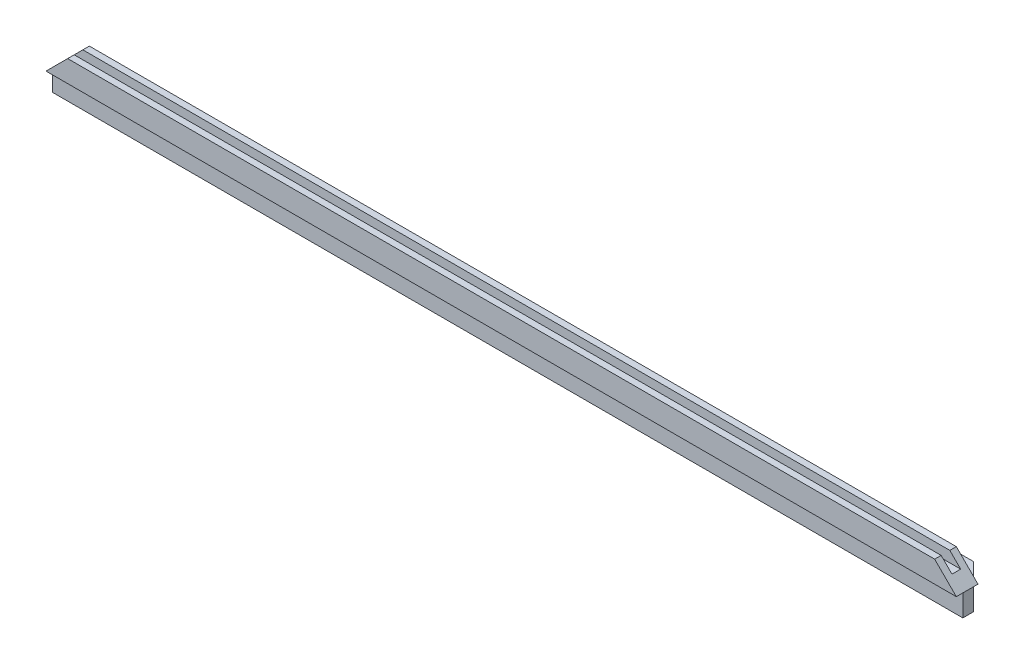
ISO-10303-21;
HEADER;
FILE_DESCRIPTION(('STEP AP214'),'2;1');
FILE_NAME('part.step','',(''),(''),'','','');
FILE_SCHEMA(('AUTOMOTIVE_DESIGN { 1 0 10303 214 1 1 1 1 }'));
ENDSEC;
DATA;
#1=APPLICATION_CONTEXT('core data for automotive mechanical design processes');
#2=APPLICATION_PROTOCOL_DEFINITION('international standard','automotive_design',2000,#1);
#3=PRODUCT_CONTEXT('',#1,'mechanical');
#4=PRODUCT('Part','Part','',(#3));
#5=PRODUCT_RELATED_PRODUCT_CATEGORY('part','',(#4));
#6=PRODUCT_DEFINITION_FORMATION('','',#4);
#7=PRODUCT_DEFINITION_CONTEXT('part definition',#1,'design');
#8=PRODUCT_DEFINITION('design','',#6,#7);
#9=PRODUCT_DEFINITION_SHAPE('','',#8);
#10=(LENGTH_UNIT() NAMED_UNIT(*) SI_UNIT(.MILLI.,.METRE.));
#11=(NAMED_UNIT(*) PLANE_ANGLE_UNIT() SI_UNIT($,.RADIAN.));
#12=(NAMED_UNIT(*) SI_UNIT($,.STERADIAN.) SOLID_ANGLE_UNIT());
#13=UNCERTAINTY_MEASURE_WITH_UNIT(LENGTH_MEASURE(1.E-05),#10,'distance_accuracy_value','');
#14=(GEOMETRIC_REPRESENTATION_CONTEXT(3) GLOBAL_UNCERTAINTY_ASSIGNED_CONTEXT((#13)) GLOBAL_UNIT_ASSIGNED_CONTEXT((#10,
#11,#12)) REPRESENTATION_CONTEXT('',''));
#15=CARTESIAN_POINT('',(0.,0.,0.));
#16=DIRECTION('',(0.,0.,1.));
#17=DIRECTION('',(1.,0.,0.));
#18=AXIS2_PLACEMENT_3D('',#15,#16,#17);
#19=CARTESIAN_POINT('',(0.,0.,41.9259450509896));
#20=DIRECTION('',(0.,0.,1.));
#21=DIRECTION('',(1.,0.,0.));
#22=AXIS2_PLACEMENT_3D('',#19,#20,#21);
#23=PLANE('',#22);
#24=DIRECTION('',(0.,1.,0.));
#25=VECTOR('',#24,1.);
#26=CARTESIAN_POINT('',(289.358553026499,7.,41.9259450509896));
#27=LINE('',#26,#25);
#28=CARTESIAN_POINT('',(289.358553026499,-3.,41.9259450509896));
#29=VERTEX_POINT('',#28);
#30=CARTESIAN_POINT('',(289.358553026499,7.,41.9259450509896));
#31=VERTEX_POINT('',#30);
#32=EDGE_CURVE('E261',#29,#31,#27,.T.);
#33=ORIENTED_EDGE('',*,*,#32,.T.);
#34=DIRECTION('',(-1.,0.,0.));
#35=VECTOR('',#34,1.);
#36=CARTESIAN_POINT('',(289.358553026499,7.,41.9259450509896));
#37=LINE('',#36,#35);
#38=CARTESIAN_POINT('',(-130.641446973501,7.,41.9259450509896));
#39=VERTEX_POINT('',#38);
#40=EDGE_CURVE('E177',#31,#39,#37,.T.);
#41=ORIENTED_EDGE('',*,*,#40,.T.);
#42=DIRECTION('',(0.,-1.,0.));
#43=VECTOR('',#42,1.);
#44=CARTESIAN_POINT('',(-130.641446973501,7.,41.9259450509896));
#45=LINE('',#44,#43);
#46=CARTESIAN_POINT('',(-130.641446973501,-3.,41.9259450509896));
#47=VERTEX_POINT('',#46);
#48=EDGE_CURVE('E255',#39,#47,#45,.T.);
#49=ORIENTED_EDGE('',*,*,#48,.T.);
#50=DIRECTION('',(1.,0.,0.));
#51=VECTOR('',#50,1.);
#52=CARTESIAN_POINT('',(-130.641446973501,-3.,41.9259450509896));
#53=LINE('',#52,#51);
#54=EDGE_CURVE('E259',#47,#29,#53,.T.);
#55=ORIENTED_EDGE('',*,*,#54,.T.);
#56=EDGE_LOOP('',(#33,#41,#49,#55));
#57=FACE_BOUND('',#56,.T.);
#58=ADVANCED_FACE('F43',(#57),#23,.T.);
#59=CARTESIAN_POINT('',(0.,7.,0.));
#60=DIRECTION('',(0.,1.,0.));
#61=DIRECTION('',(0.,0.,1.));
#62=AXIS2_PLACEMENT_3D('',#59,#60,#61);
#63=PLANE('',#62);
#64=DIRECTION('',(-1.,0.,0.));
#65=VECTOR('',#64,1.);
#66=CARTESIAN_POINT('',(289.358553026499,7.,34.9259450509896));
#67=LINE('',#66,#65);
#68=CARTESIAN_POINT('',(287.358553026499,7.,34.9259450509896));
#69=VERTEX_POINT('',#68);
#70=CARTESIAN_POINT('',(-128.6414469735,7.,34.9259450509895));
#71=VERTEX_POINT('',#70);
#72=EDGE_CURVE('E219',#69,#71,#67,.T.);
#73=ORIENTED_EDGE('',*,*,#72,.F.);
#74=DIRECTION('',(-0.707106781186552,0.,-0.707106781186543));
#75=VECTOR('',#74,1.);
#76=CARTESIAN_POINT('',(289.358553026499,7.,36.9259450509896));
#77=LINE('',#76,#75);
#78=CARTESIAN_POINT('',(279.358553026499,7.,26.9259450509896));
#79=VERTEX_POINT('',#78);
#80=EDGE_CURVE('E296',#69,#79,#77,.T.);
#81=ORIENTED_EDGE('',*,*,#80,.T.);
#82=DIRECTION('',(-1.,0.,0.));
#83=VECTOR('',#82,1.);
#84=CARTESIAN_POINT('',(-120.641446973501,7.,26.9259450509896));
#85=LINE('',#84,#83);
#86=CARTESIAN_POINT('',(-120.641446973501,7.,26.9259450509896));
#87=VERTEX_POINT('',#86);
#88=EDGE_CURVE('E295',#79,#87,#85,.T.);
#89=ORIENTED_EDGE('',*,*,#88,.T.);
#90=DIRECTION('',(-0.707106781186546,0.,0.707106781186549));
#91=VECTOR('',#90,1.);
#92=CARTESIAN_POINT('',(-130.641446973501,7.,36.9259450509896));
#93=LINE('',#92,#91);
#94=EDGE_CURVE('E298',#87,#71,#93,.T.);
#95=ORIENTED_EDGE('',*,*,#94,.T.);
#96=EDGE_LOOP('',(#73,#81,#89,#95));
#97=FACE_BOUND('',#96,.T.);
#98=ADVANCED_FACE('F356',(#97),#63,.T.);
#99=CARTESIAN_POINT('',(-130.641446973501,4.,36.9259450509896));
#100=DIRECTION('',(0.707106781186549,0.,0.707106781186546));
#101=DIRECTION('',(0.707106781186546,0.,-0.707106781186549));
#102=AXIS2_PLACEMENT_3D('',#99,#100,#101);
#103=PLANE('',#102);
#104=DIRECTION('',(0.,-1.,0.));
#105=VECTOR('',#104,1.);
#106=CARTESIAN_POINT('',(-125.641446973501,4.,31.9259450509896));
#107=LINE('',#106,#105);
#108=CARTESIAN_POINT('',(-125.641446973501,4.,31.9259450509896));
#109=VERTEX_POINT('',#108);
#110=CARTESIAN_POINT('',(-125.641446973501,0.,31.9259450509896));
#111=VERTEX_POINT('',#110);
#112=EDGE_CURVE('E317',#109,#111,#107,.T.);
#113=ORIENTED_EDGE('',*,*,#112,.T.);
#114=DIRECTION('',(-0.707106781186546,0.,0.707106781186549));
#115=VECTOR('',#114,1.);
#116=CARTESIAN_POINT('',(-130.641446973501,0.,36.9259450509896));
#117=LINE('',#116,#115);
#118=CARTESIAN_POINT('',(-120.641446973501,0.,26.9259450509896));
#119=VERTEX_POINT('',#118);
#120=EDGE_CURVE('E271',#119,#111,#117,.T.);
#121=ORIENTED_EDGE('',*,*,#120,.F.);
#122=DIRECTION('',(0.,1.,0.));
#123=VECTOR('',#122,1.);
#124=CARTESIAN_POINT('',(-120.641446973501,-3.,26.9259450509896));
#125=LINE('',#124,#123);
#126=CARTESIAN_POINT('',(-120.641446973501,-3.,26.9259450509896));
#127=VERTEX_POINT('',#126);
#128=EDGE_CURVE('E290',#127,#119,#125,.T.);
#129=ORIENTED_EDGE('',*,*,#128,.F.);
#130=DIRECTION('',(-0.707106781186546,0.,0.707106781186549));
#131=VECTOR('',#130,1.);
#132=CARTESIAN_POINT('',(-130.641446973501,-3.,36.9259450509896));
#133=LINE('',#132,#131);
#134=CARTESIAN_POINT('',(-130.641446973501,-3.,36.9259450509896));
#135=VERTEX_POINT('',#134);
#136=EDGE_CURVE('E272',#127,#135,#133,.T.);
#137=ORIENTED_EDGE('',*,*,#136,.T.);
#138=DIRECTION('',(0.,-1.,0.));
#139=VECTOR('',#138,1.);
#140=CARTESIAN_POINT('',(-130.641446973501,4.,36.9259450509896));
#141=LINE('',#140,#139);
#142=CARTESIAN_POINT('',(-130.641446973501,7.,36.9259450509896));
#143=VERTEX_POINT('',#142);
#144=EDGE_CURVE('E11',#143,#135,#141,.T.);
#145=ORIENTED_EDGE('',*,*,#144,.F.);
#146=DIRECTION('',(-0.707106781186546,0.,0.707106781186549));
#147=VECTOR('',#146,1.);
#148=CARTESIAN_POINT('',(-130.641446973501,7.,36.9259450509896));
#149=LINE('',#148,#147);
#150=EDGE_CURVE('E243',#71,#143,#149,.T.);
#151=ORIENTED_EDGE('',*,*,#150,.F.);
#152=ORIENTED_EDGE('',*,*,#94,.F.);
#153=DIRECTION('',(0.,-1.,0.));
#154=VECTOR('',#153,1.);
#155=CARTESIAN_POINT('',(-120.641446973501,7.,26.9259450509896));
#156=LINE('',#155,#154);
#157=CARTESIAN_POINT('',(-120.641446973501,4.,26.9259450509896));
#158=VERTEX_POINT('',#157);
#159=EDGE_CURVE('E301',#87,#158,#156,.T.);
#160=ORIENTED_EDGE('',*,*,#159,.T.);
#161=DIRECTION('',(-0.707106781186546,0.,0.707106781186549));
#162=VECTOR('',#161,1.);
#163=CARTESIAN_POINT('',(-130.641446973501,4.,36.9259450509896));
#164=LINE('',#163,#162);
#165=EDGE_CURVE('E305',#158,#109,#164,.T.);
#166=ORIENTED_EDGE('',*,*,#165,.T.);
#167=EDGE_LOOP('',(#113,#121,#129,#137,#145,#151,#152,#160,#166));
#168=FACE_BOUND('',#167,.T.);
#169=ADVANCED_FACE('F45',(#168),#103,.F.);
#170=CARTESIAN_POINT('',(284.358553026499,4.,31.9259450509896));
#171=DIRECTION('',(-0.707106781186544,0.,0.707106781186552));
#172=DIRECTION('',(0.707106781186551,0.,0.707106781186544));
#173=AXIS2_PLACEMENT_3D('',#170,#171,#172);
#174=PLANE('',#173);
#175=DIRECTION('',(0.,-1.,0.));
#176=VECTOR('',#175,1.);
#177=CARTESIAN_POINT('',(289.358553026499,4.,36.9259450509896));
#178=LINE('',#177,#176);
#179=CARTESIAN_POINT('',(289.358553026499,7.,36.9259450509896));
#180=VERTEX_POINT('',#179);
#181=CARTESIAN_POINT('',(289.358553026499,-3.,36.9259450509896));
#182=VERTEX_POINT('',#181);
#183=EDGE_CURVE('E52',#180,#182,#178,.T.);
#184=ORIENTED_EDGE('',*,*,#183,.T.);
#185=DIRECTION('',(-0.707106781186552,0.,-0.707106781186543));
#186=VECTOR('',#185,1.);
#187=CARTESIAN_POINT('',(289.358553026499,-3.,36.9259450509896));
#188=LINE('',#187,#186);
#189=CARTESIAN_POINT('',(279.358553026499,-3.,26.9259450509896));
#190=VERTEX_POINT('',#189);
#191=EDGE_CURVE('E279',#182,#190,#188,.T.);
#192=ORIENTED_EDGE('',*,*,#191,.T.);
#193=DIRECTION('',(0.,1.,0.));
#194=VECTOR('',#193,1.);
#195=CARTESIAN_POINT('',(279.358553026499,-3.,26.9259450509896));
#196=LINE('',#195,#194);
#197=CARTESIAN_POINT('',(279.358553026499,0.,26.9259450509896));
#198=VERTEX_POINT('',#197);
#199=EDGE_CURVE('E282',#190,#198,#196,.T.);
#200=ORIENTED_EDGE('',*,*,#199,.T.);
#201=DIRECTION('',(-0.707106781186552,0.,-0.707106781186543));
#202=VECTOR('',#201,1.);
#203=CARTESIAN_POINT('',(289.358553026499,0.,36.9259450509896));
#204=LINE('',#203,#202);
#205=CARTESIAN_POINT('',(284.358553026499,0.,31.9259450509896));
#206=VERTEX_POINT('',#205);
#207=EDGE_CURVE('E276',#206,#198,#204,.T.);
#208=ORIENTED_EDGE('',*,*,#207,.F.);
#209=DIRECTION('',(0.,-1.,0.));
#210=VECTOR('',#209,1.);
#211=CARTESIAN_POINT('',(284.358553026499,4.,31.9259450509896));
#212=LINE('',#211,#210);
#213=CARTESIAN_POINT('',(284.358553026499,4.,31.9259450509896));
#214=VERTEX_POINT('',#213);
#215=EDGE_CURVE('E58',#214,#206,#212,.T.);
#216=ORIENTED_EDGE('',*,*,#215,.F.);
#217=DIRECTION('',(-0.707106781186552,0.,-0.707106781186543));
#218=VECTOR('',#217,1.);
#219=CARTESIAN_POINT('',(289.358553026499,4.,36.9259450509896));
#220=LINE('',#219,#218);
#221=CARTESIAN_POINT('',(279.358553026499,4.,26.9259450509896));
#222=VERTEX_POINT('',#221);
#223=EDGE_CURVE('E292',#214,#222,#220,.T.);
#224=ORIENTED_EDGE('',*,*,#223,.T.);
#225=DIRECTION('',(0.,-1.,0.));
#226=VECTOR('',#225,1.);
#227=CARTESIAN_POINT('',(279.358553026499,7.,26.9259450509896));
#228=LINE('',#227,#226);
#229=EDGE_CURVE('E310',#79,#222,#228,.T.);
#230=ORIENTED_EDGE('',*,*,#229,.F.);
#231=ORIENTED_EDGE('',*,*,#80,.F.);
#232=EDGE_CURVE('E293',#180,#69,#77,.T.);
#233=ORIENTED_EDGE('',*,*,#232,.F.);
#234=EDGE_LOOP('',(#184,#192,#200,#208,#216,#224,#230,#231,#233));
#235=FACE_BOUND('',#234,.T.);
#236=ADVANCED_FACE('F326',(#235),#174,.F.);
#237=CARTESIAN_POINT('',(-125.641446973501,4.,31.9259450509896));
#238=DIRECTION('',(0.,0.,1.));
#239=DIRECTION('',(1.,0.,0.));
#240=AXIS2_PLACEMENT_3D('',#237,#238,#239);
#241=PLANE('',#240);
#242=DIRECTION('',(-1.,0.,0.));
#243=VECTOR('',#242,1.);
#244=CARTESIAN_POINT('',(-125.641446973501,0.,31.9259450509896));
#245=LINE('',#244,#243);
#246=EDGE_CURVE('E313',#206,#111,#245,.T.);
#247=ORIENTED_EDGE('',*,*,#246,.T.);
#248=ORIENTED_EDGE('',*,*,#112,.F.);
#249=DIRECTION('',(-1.,0.,0.));
#250=VECTOR('',#249,1.);
#251=CARTESIAN_POINT('',(-125.641446973501,4.,31.9259450509896));
#252=LINE('',#251,#250);
#253=EDGE_CURVE('E314',#214,#109,#252,.T.);
#254=ORIENTED_EDGE('',*,*,#253,.F.);
#255=ORIENTED_EDGE('',*,*,#215,.T.);
#256=EDGE_LOOP('',(#247,#248,#254,#255));
#257=FACE_BOUND('',#256,.T.);
#258=ADVANCED_FACE('F342',(#257),#241,.F.);
#259=CARTESIAN_POINT('',(0.,4.,0.));
#260=DIRECTION('',(0.,1.,0.));
#261=DIRECTION('',(0.,0.,1.));
#262=AXIS2_PLACEMENT_3D('',#259,#260,#261);
#263=PLANE('',#262);
#264=ORIENTED_EDGE('',*,*,#223,.F.);
#265=ORIENTED_EDGE('',*,*,#253,.T.);
#266=ORIENTED_EDGE('',*,*,#165,.F.);
#267=DIRECTION('',(-1.,0.,0.));
#268=VECTOR('',#267,1.);
#269=CARTESIAN_POINT('',(-120.641446973501,4.,26.9259450509896));
#270=LINE('',#269,#268);
#271=EDGE_CURVE('E303',#222,#158,#270,.T.);
#272=ORIENTED_EDGE('',*,*,#271,.F.);
#273=EDGE_LOOP('',(#264,#265,#266,#272));
#274=FACE_BOUND('',#273,.T.);
#275=ADVANCED_FACE('F347',(#274),#263,.F.);
#276=CARTESIAN_POINT('',(-120.641446973501,7.,26.9259450509896));
#277=DIRECTION('',(0.,0.,1.));
#278=DIRECTION('',(1.,0.,0.));
#279=AXIS2_PLACEMENT_3D('',#276,#277,#278);
#280=PLANE('',#279);
#281=ORIENTED_EDGE('',*,*,#271,.T.);
#282=ORIENTED_EDGE('',*,*,#159,.F.);
#283=ORIENTED_EDGE('',*,*,#88,.F.);
#284=ORIENTED_EDGE('',*,*,#229,.T.);
#285=EDGE_LOOP('',(#281,#282,#283,#284));
#286=FACE_BOUND('',#285,.T.);
#287=ADVANCED_FACE('F351',(#286),#280,.F.);
#288=CARTESIAN_POINT('',(-120.641446973501,-3.,26.9259450509896));
#289=DIRECTION('',(0.,0.,-1.));
#290=DIRECTION('',(-1.,0.,0.));
#291=AXIS2_PLACEMENT_3D('',#288,#289,#290);
#292=PLANE('',#291);
#293=DIRECTION('',(-1.,0.,0.));
#294=VECTOR('',#293,1.);
#295=CARTESIAN_POINT('',(-120.641446973501,0.,26.9259450509896));
#296=LINE('',#295,#294);
#297=EDGE_CURVE('E284',#198,#119,#296,.T.);
#298=ORIENTED_EDGE('',*,*,#297,.F.);
#299=ORIENTED_EDGE('',*,*,#199,.F.);
#300=DIRECTION('',(-1.,0.,0.));
#301=VECTOR('',#300,1.);
#302=CARTESIAN_POINT('',(-120.641446973501,-3.,26.9259450509896));
#303=LINE('',#302,#301);
#304=EDGE_CURVE('E275',#190,#127,#303,.T.);
#305=ORIENTED_EDGE('',*,*,#304,.T.);
#306=ORIENTED_EDGE('',*,*,#128,.T.);
#307=EDGE_LOOP('',(#298,#299,#305,#306));
#308=FACE_BOUND('',#307,.T.);
#309=ADVANCED_FACE('F338',(#308),#292,.T.);
#310=CARTESIAN_POINT('',(0.,-3.,0.));
#311=DIRECTION('',(0.,-1.,0.));
#312=DIRECTION('',(0.,0.,1.));
#313=AXIS2_PLACEMENT_3D('',#310,#311,#312);
#314=PLANE('',#313);
#315=ORIENTED_EDGE('',*,*,#191,.F.);
#316=DIRECTION('',(0.,0.,-1.));
#317=VECTOR('',#316,1.);
#318=CARTESIAN_POINT('',(289.358553026499,-3.,41.9259450509896));
#319=LINE('',#318,#317);
#320=EDGE_CURVE('E267',#29,#182,#319,.T.);
#321=ORIENTED_EDGE('',*,*,#320,.F.);
#322=ORIENTED_EDGE('',*,*,#54,.F.);
#323=DIRECTION('',(0.,0.,-1.));
#324=VECTOR('',#323,1.);
#325=CARTESIAN_POINT('',(-130.641446973501,-3.,41.9259450509896));
#326=LINE('',#325,#324);
#327=EDGE_CURVE('E269',#47,#135,#326,.T.);
#328=ORIENTED_EDGE('',*,*,#327,.T.);
#329=ORIENTED_EDGE('',*,*,#136,.F.);
#330=ORIENTED_EDGE('',*,*,#304,.F.);
#331=EDGE_LOOP('',(#315,#321,#322,#328,#329,#330));
#332=FACE_BOUND('',#331,.T.);
#333=ADVANCED_FACE('F333',(#332),#314,.T.);
#334=CARTESIAN_POINT('',(0.,0.,0.));
#335=DIRECTION('',(0.,-1.,0.));
#336=DIRECTION('',(0.,0.,1.));
#337=AXIS2_PLACEMENT_3D('',#334,#335,#336);
#338=PLANE('',#337);
#339=ORIENTED_EDGE('',*,*,#246,.F.);
#340=ORIENTED_EDGE('',*,*,#207,.T.);
#341=ORIENTED_EDGE('',*,*,#297,.T.);
#342=ORIENTED_EDGE('',*,*,#120,.T.);
#343=EDGE_LOOP('',(#339,#340,#341,#342));
#344=FACE_BOUND('',#343,.T.);
#345=ADVANCED_FACE('F425',(#344),#338,.F.);
#346=CARTESIAN_POINT('',(-130.641446973501,7.,41.9259450509896));
#347=DIRECTION('',(1.,0.,0.));
#348=DIRECTION('',(0.,0.,-1.));
#349=AXIS2_PLACEMENT_3D('',#346,#347,#348);
#350=PLANE('',#349);
#351=ORIENTED_EDGE('',*,*,#144,.T.);
#352=ORIENTED_EDGE('',*,*,#327,.F.);
#353=ORIENTED_EDGE('',*,*,#48,.F.);
#354=DIRECTION('',(0.,0.,-1.));
#355=VECTOR('',#354,1.);
#356=CARTESIAN_POINT('',(-130.641446973501,7.,41.9259450509896));
#357=LINE('',#356,#355);
#358=EDGE_CURVE('E263',#39,#143,#357,.T.);
#359=ORIENTED_EDGE('',*,*,#358,.T.);
#360=EDGE_LOOP('',(#351,#352,#353,#359));
#361=FACE_BOUND('',#360,.T.);
#362=ADVANCED_FACE('F374',(#361),#350,.F.);
#363=CARTESIAN_POINT('',(289.358553026499,7.,41.9259450509896));
#364=DIRECTION('',(-1.,0.,0.));
#365=DIRECTION('',(0.,0.,1.));
#366=AXIS2_PLACEMENT_3D('',#363,#364,#365);
#367=PLANE('',#366);
#368=ORIENTED_EDGE('',*,*,#183,.F.);
#369=DIRECTION('',(0.,0.,-1.));
#370=VECTOR('',#369,1.);
#371=CARTESIAN_POINT('',(289.358553026499,7.,41.9259450509896));
#372=LINE('',#371,#370);
#373=EDGE_CURVE('E265',#31,#180,#372,.T.);
#374=ORIENTED_EDGE('',*,*,#373,.F.);
#375=ORIENTED_EDGE('',*,*,#32,.F.);
#376=ORIENTED_EDGE('',*,*,#320,.T.);
#377=EDGE_LOOP('',(#368,#374,#375,#376));
#378=FACE_BOUND('',#377,.T.);
#379=ADVANCED_FACE('F377',(#378),#367,.F.);
#380=CARTESIAN_POINT('',(-125.6414469735,12.,37.9259450509896));
#381=DIRECTION('',(-0.707106781186543,0.707106781186552,0.));
#382=DIRECTION('',(-0.707106781186552,-0.707106781186543,0.));
#383=AXIS2_PLACEMENT_3D('',#380,#381,#382);
#384=PLANE('',#383);
#385=ORIENTED_EDGE('',*,*,#358,.F.);
#386=DIRECTION('',(0.,0.,-1.));
#387=VECTOR('',#386,1.);
#388=CARTESIAN_POINT('',(-130.641446973501,7.,44.9259450509896));
#389=LINE('',#388,#387);
#390=CARTESIAN_POINT('',(-130.641446973501,7.,44.9259450509896));
#391=VERTEX_POINT('',#390);
#392=EDGE_CURVE('E202',#391,#39,#389,.T.);
#393=ORIENTED_EDGE('',*,*,#392,.F.);
#394=DIRECTION('',(0.707106781186551,0.707106781186544,0.));
#395=VECTOR('',#394,1.);
#396=CARTESIAN_POINT('',(-130.641446973501,7.,44.9259450509896));
#397=LINE('',#396,#395);
#398=CARTESIAN_POINT('',(-120.6414469735,17.,44.9259450509896));
#399=VERTEX_POINT('',#398);
#400=EDGE_CURVE('E191',#391,#399,#397,.T.);
#401=ORIENTED_EDGE('',*,*,#400,.T.);
#402=DIRECTION('',(0.,0.,-1.));
#403=VECTOR('',#402,1.);
#404=CARTESIAN_POINT('',(-120.6414469735,17.,44.9259450509896));
#405=LINE('',#404,#403);
#406=CARTESIAN_POINT('',(-120.6414469735,17.,41.9259450509896));
#407=VERTEX_POINT('',#406);
#408=EDGE_CURVE('E211',#399,#407,#405,.T.);
#409=ORIENTED_EDGE('',*,*,#408,.T.);
#410=DIRECTION('',(0.707106781186551,0.707106781186544,0.));
#411=VECTOR('',#410,1.);
#412=CARTESIAN_POINT('',(-130.641446973501,7.,41.9259450509896));
#413=LINE('',#412,#411);
#414=CARTESIAN_POINT('',(-125.6414469735,12.,41.9259450509896));
#415=VERTEX_POINT('',#414);
#416=EDGE_CURVE('E192',#415,#407,#413,.T.);
#417=ORIENTED_EDGE('',*,*,#416,.F.);
#418=DIRECTION('',(0.,0.,1.));
#419=VECTOR('',#418,1.);
#420=CARTESIAN_POINT('',(-125.6414469735,12.,37.9259450509896));
#421=LINE('',#420,#419);
#422=CARTESIAN_POINT('',(-125.6414469735,12.,37.9259450509896));
#423=VERTEX_POINT('',#422);
#424=EDGE_CURVE('E252',#423,#415,#421,.T.);
#425=ORIENTED_EDGE('',*,*,#424,.F.);
#426=DIRECTION('',(0.707106781186551,0.707106781186544,0.));
#427=VECTOR('',#426,1.);
#428=CARTESIAN_POINT('',(-130.641446973501,7.,37.9259450509896));
#429=LINE('',#428,#427);
#430=CARTESIAN_POINT('',(-120.6414469735,17.,37.9259450509896));
#431=VERTEX_POINT('',#430);
#432=EDGE_CURVE('E181',#423,#431,#429,.T.);
#433=ORIENTED_EDGE('',*,*,#432,.T.);
#434=DIRECTION('',(0.,0.,1.));
#435=VECTOR('',#434,1.);
#436=CARTESIAN_POINT('',(-120.6414469735,17.,34.9259450509896));
#437=LINE('',#436,#435);
#438=CARTESIAN_POINT('',(-120.6414469735,17.,34.9259450509896));
#439=VERTEX_POINT('',#438);
#440=EDGE_CURVE('E237',#439,#431,#437,.T.);
#441=ORIENTED_EDGE('',*,*,#440,.F.);
#442=DIRECTION('',(0.707106781186551,0.707106781186544,0.));
#443=VECTOR('',#442,1.);
#444=CARTESIAN_POINT('',(-130.641446973501,7.,34.9259450509896));
#445=LINE('',#444,#443);
#446=CARTESIAN_POINT('',(-130.641446973501,7.,34.9259450509896));
#447=VERTEX_POINT('',#446);
#448=EDGE_CURVE('E218',#447,#439,#445,.T.);
#449=ORIENTED_EDGE('',*,*,#448,.F.);
#450=DIRECTION('',(0.,0.,1.));
#451=VECTOR('',#450,1.);
#452=CARTESIAN_POINT('',(-130.641446973501,7.,34.9259450509896));
#453=LINE('',#452,#451);
#454=EDGE_CURVE('E240',#447,#143,#453,.T.);
#455=ORIENTED_EDGE('',*,*,#454,.T.);
#456=EDGE_LOOP('',(#385,#393,#401,#409,#417,#425,#433,#441,#449,#455));
#457=FACE_BOUND('',#456,.T.);
#458=ADVANCED_FACE('F367',(#457),#384,.T.);
#459=CARTESIAN_POINT('',(-125.6414469735,12.,37.9259450509896));
#460=DIRECTION('',(0.,1.,0.));
#461=DIRECTION('',(-1.,0.,0.));
#462=AXIS2_PLACEMENT_3D('',#459,#460,#461);
#463=PLANE('',#462);
#464=DIRECTION('',(-1.,0.,0.));
#465=VECTOR('',#464,1.);
#466=CARTESIAN_POINT('',(-125.6414469735,12.,41.9259450509896));
#467=LINE('',#466,#465);
#468=CARTESIAN_POINT('',(284.358553026499,12.,41.9259450509896));
#469=VERTEX_POINT('',#468);
#470=EDGE_CURVE('E246',#469,#415,#467,.T.);
#471=ORIENTED_EDGE('',*,*,#470,.F.);
#472=DIRECTION('',(0.,0.,1.));
#473=VECTOR('',#472,1.);
#474=CARTESIAN_POINT('',(284.358553026499,12.,37.9259450509896));
#475=LINE('',#474,#473);
#476=CARTESIAN_POINT('',(284.358553026499,12.,37.9259450509896));
#477=VERTEX_POINT('',#476);
#478=EDGE_CURVE('E250',#477,#469,#475,.T.);
#479=ORIENTED_EDGE('',*,*,#478,.F.);
#480=DIRECTION('',(-1.,0.,0.));
#481=VECTOR('',#480,1.);
#482=CARTESIAN_POINT('',(-125.6414469735,12.,37.9259450509896));
#483=LINE('',#482,#481);
#484=EDGE_CURVE('E247',#477,#423,#483,.T.);
#485=ORIENTED_EDGE('',*,*,#484,.T.);
#486=ORIENTED_EDGE('',*,*,#424,.T.);
#487=EDGE_LOOP('',(#471,#479,#485,#486));
#488=FACE_BOUND('',#487,.T.);
#489=ADVANCED_FACE('F394',(#488),#463,.T.);
#490=CARTESIAN_POINT('',(284.358553026499,12.,37.9259450509896));
#491=DIRECTION('',(0.707106781186552,0.707106781186544,0.));
#492=DIRECTION('',(-0.707106781186544,0.707106781186551,0.));
#493=AXIS2_PLACEMENT_3D('',#490,#491,#492);
#494=PLANE('',#493);
#495=ORIENTED_EDGE('',*,*,#478,.T.);
#496=DIRECTION('',(0.707106781186546,-0.707106781186549,0.));
#497=VECTOR('',#496,1.);
#498=CARTESIAN_POINT('',(289.358553026499,7.,41.9259450509896));
#499=LINE('',#498,#497);
#500=CARTESIAN_POINT('',(279.358553026499,17.,41.9259450509896));
#501=VERTEX_POINT('',#500);
#502=EDGE_CURVE('E204',#501,#469,#499,.T.);
#503=ORIENTED_EDGE('',*,*,#502,.F.);
#504=DIRECTION('',(0.,0.,-1.));
#505=VECTOR('',#504,1.);
#506=CARTESIAN_POINT('',(279.358553026499,17.,44.9259450509896));
#507=LINE('',#506,#505);
#508=CARTESIAN_POINT('',(279.358553026499,17.,44.9259450509896));
#509=VERTEX_POINT('',#508);
#510=EDGE_CURVE('E182',#509,#501,#507,.T.);
#511=ORIENTED_EDGE('',*,*,#510,.F.);
#512=DIRECTION('',(0.707106781186546,-0.707106781186549,0.));
#513=VECTOR('',#512,1.);
#514=CARTESIAN_POINT('',(289.358553026499,7.,44.9259450509896));
#515=LINE('',#514,#513);
#516=CARTESIAN_POINT('',(289.358553026499,7.,44.9259450509896));
#517=VERTEX_POINT('',#516);
#518=EDGE_CURVE('E188',#509,#517,#515,.T.);
#519=ORIENTED_EDGE('',*,*,#518,.T.);
#520=DIRECTION('',(0.,0.,-1.));
#521=VECTOR('',#520,1.);
#522=CARTESIAN_POINT('',(289.358553026499,7.,44.9259450509896));
#523=LINE('',#522,#521);
#524=EDGE_CURVE('E171',#517,#31,#523,.T.);
#525=ORIENTED_EDGE('',*,*,#524,.T.);
#526=ORIENTED_EDGE('',*,*,#373,.T.);
#527=DIRECTION('',(0.,0.,1.));
#528=VECTOR('',#527,1.);
#529=CARTESIAN_POINT('',(289.358553026499,7.,34.9259450509896));
#530=LINE('',#529,#528);
#531=CARTESIAN_POINT('',(289.358553026499,7.,34.9259450509896));
#532=VERTEX_POINT('',#531);
#533=EDGE_CURVE('E226',#532,#180,#530,.T.);
#534=ORIENTED_EDGE('',*,*,#533,.F.);
#535=DIRECTION('',(0.707106781186546,-0.707106781186549,0.));
#536=VECTOR('',#535,1.);
#537=CARTESIAN_POINT('',(289.358553026499,7.,34.9259450509896));
#538=LINE('',#537,#536);
#539=CARTESIAN_POINT('',(279.358553026499,17.,34.9259450509896));
#540=VERTEX_POINT('',#539);
#541=EDGE_CURVE('E224',#540,#532,#538,.T.);
#542=ORIENTED_EDGE('',*,*,#541,.F.);
#543=DIRECTION('',(0.,0.,1.));
#544=VECTOR('',#543,1.);
#545=CARTESIAN_POINT('',(279.358553026499,17.,34.9259450509896));
#546=LINE('',#545,#544);
#547=CARTESIAN_POINT('',(279.358553026499,17.,37.9259450509896));
#548=VERTEX_POINT('',#547);
#549=EDGE_CURVE('E234',#540,#548,#546,.T.);
#550=ORIENTED_EDGE('',*,*,#549,.T.);
#551=DIRECTION('',(0.707106781186546,-0.707106781186549,0.));
#552=VECTOR('',#551,1.);
#553=CARTESIAN_POINT('',(289.358553026499,7.,37.9259450509896));
#554=LINE('',#553,#552);
#555=EDGE_CURVE('E230',#548,#477,#554,.T.);
#556=ORIENTED_EDGE('',*,*,#555,.T.);
#557=EDGE_LOOP('',(#495,#503,#511,#519,#525,#526,#534,#542,#550,#556));
#558=FACE_BOUND('',#557,.T.);
#559=ADVANCED_FACE('F195',(#558),#494,.T.);
#560=CARTESIAN_POINT('',(289.358553026499,7.,34.9259450509896));
#561=DIRECTION('',(0.,1.,0.));
#562=DIRECTION('',(0.,0.,1.));
#563=AXIS2_PLACEMENT_3D('',#560,#561,#562);
#564=PLANE('',#563);
#565=EDGE_CURVE('E220',#71,#447,#67,.T.);
#566=ORIENTED_EDGE('',*,*,#565,.F.);
#567=ORIENTED_EDGE('',*,*,#150,.T.);
#568=ORIENTED_EDGE('',*,*,#454,.F.);
#569=EDGE_LOOP('',(#566,#567,#568));
#570=FACE_BOUND('',#569,.T.);
#571=ADVANCED_FACE('F370',(#570),#564,.F.);
#572=ORIENTED_EDGE('',*,*,#533,.T.);
#573=ORIENTED_EDGE('',*,*,#232,.T.);
#574=EDGE_CURVE('E215',#532,#69,#67,.T.);
#575=ORIENTED_EDGE('',*,*,#574,.F.);
#576=EDGE_LOOP('',(#572,#573,#575));
#577=FACE_BOUND('',#576,.T.);
#578=ADVANCED_FACE('F382',(#577),#564,.F.);
#579=CARTESIAN_POINT('',(279.358553026499,17.,34.9259450509896));
#580=DIRECTION('',(0.,-1.,0.));
#581=DIRECTION('',(0.,0.,-1.));
#582=AXIS2_PLACEMENT_3D('',#579,#580,#581);
#583=PLANE('',#582);
#584=DIRECTION('',(1.,0.,0.));
#585=VECTOR('',#584,1.);
#586=CARTESIAN_POINT('',(279.358553026499,17.,37.9259450509896));
#587=LINE('',#586,#585);
#588=EDGE_CURVE('E228',#431,#548,#587,.T.);
#589=ORIENTED_EDGE('',*,*,#588,.T.);
#590=ORIENTED_EDGE('',*,*,#549,.F.);
#591=DIRECTION('',(1.,0.,0.));
#592=VECTOR('',#591,1.);
#593=CARTESIAN_POINT('',(279.358553026499,17.,34.9259450509896));
#594=LINE('',#593,#592);
#595=EDGE_CURVE('E222',#439,#540,#594,.T.);
#596=ORIENTED_EDGE('',*,*,#595,.F.);
#597=ORIENTED_EDGE('',*,*,#440,.T.);
#598=EDGE_LOOP('',(#589,#590,#596,#597));
#599=FACE_BOUND('',#598,.T.);
#600=ADVANCED_FACE('F401',(#599),#583,.F.);
#601=CARTESIAN_POINT('',(0.,0.,34.9259450509896));
#602=DIRECTION('',(0.,0.,-1.));
#603=DIRECTION('',(-1.,0.,0.));
#604=AXIS2_PLACEMENT_3D('',#601,#602,#603);
#605=PLANE('',#604);
#606=ORIENTED_EDGE('',*,*,#574,.T.);
#607=ORIENTED_EDGE('',*,*,#72,.T.);
#608=ORIENTED_EDGE('',*,*,#565,.T.);
#609=ORIENTED_EDGE('',*,*,#448,.T.);
#610=ORIENTED_EDGE('',*,*,#595,.T.);
#611=ORIENTED_EDGE('',*,*,#541,.T.);
#612=EDGE_LOOP('',(#606,#607,#608,#609,#610,#611));
#613=FACE_BOUND('',#612,.T.);
#614=ADVANCED_FACE('F361',(#613),#605,.T.);
#615=CARTESIAN_POINT('',(0.,0.,37.9259450509896));
#616=DIRECTION('',(0.,0.,-1.));
#617=DIRECTION('',(-1.,0.,0.));
#618=AXIS2_PLACEMENT_3D('',#615,#616,#617);
#619=PLANE('',#618);
#620=ORIENTED_EDGE('',*,*,#484,.F.);
#621=ORIENTED_EDGE('',*,*,#555,.F.);
#622=ORIENTED_EDGE('',*,*,#588,.F.);
#623=ORIENTED_EDGE('',*,*,#432,.F.);
#624=EDGE_LOOP('',(#620,#621,#622,#623));
#625=FACE_BOUND('',#624,.T.);
#626=ADVANCED_FACE('F389',(#625),#619,.F.);
#627=CARTESIAN_POINT('',(0.,0.,41.9259450509896));
#628=DIRECTION('',(0.,0.,1.));
#629=DIRECTION('',(-1.,0.,0.));
#630=AXIS2_PLACEMENT_3D('',#627,#628,#629);
#631=PLANE('',#630);
#632=ORIENTED_EDGE('',*,*,#502,.T.);
#633=ORIENTED_EDGE('',*,*,#470,.T.);
#634=ORIENTED_EDGE('',*,*,#416,.T.);
#635=DIRECTION('',(1.,0.,0.));
#636=VECTOR('',#635,1.);
#637=CARTESIAN_POINT('',(279.358553026499,17.,41.9259450509896));
#638=LINE('',#637,#636);
#639=EDGE_CURVE('E206',#407,#501,#638,.T.);
#640=ORIENTED_EDGE('',*,*,#639,.T.);
#641=EDGE_LOOP('',(#632,#633,#634,#640));
#642=FACE_BOUND('',#641,.T.);
#643=ADVANCED_FACE('F397',(#642),#631,.F.);
#644=CARTESIAN_POINT('',(289.358553026499,7.,44.9259450509896));
#645=DIRECTION('',(0.,-1.,0.));
#646=DIRECTION('',(0.,0.,-1.));
#647=AXIS2_PLACEMENT_3D('',#644,#645,#646);
#648=PLANE('',#647);
#649=ORIENTED_EDGE('',*,*,#40,.F.);
#650=ORIENTED_EDGE('',*,*,#524,.F.);
#651=DIRECTION('',(-1.,0.,0.));
#652=VECTOR('',#651,1.);
#653=CARTESIAN_POINT('',(289.358553026499,7.,44.9259450509896));
#654=LINE('',#653,#652);
#655=EDGE_CURVE('E174',#517,#391,#654,.T.);
#656=ORIENTED_EDGE('',*,*,#655,.T.);
#657=ORIENTED_EDGE('',*,*,#392,.T.);
#658=EDGE_LOOP('',(#649,#650,#656,#657));
#659=FACE_BOUND('',#658,.T.);
#660=ADVANCED_FACE('F173',(#659),#648,.T.);
#661=CARTESIAN_POINT('',(279.358553026499,17.,44.9259450509896));
#662=DIRECTION('',(0.,1.,0.));
#663=DIRECTION('',(0.,0.,1.));
#664=AXIS2_PLACEMENT_3D('',#661,#662,#663);
#665=PLANE('',#664);
#666=ORIENTED_EDGE('',*,*,#639,.F.);
#667=ORIENTED_EDGE('',*,*,#408,.F.);
#668=DIRECTION('',(1.,0.,0.));
#669=VECTOR('',#668,1.);
#670=CARTESIAN_POINT('',(279.358553026499,17.,44.9259450509896));
#671=LINE('',#670,#669);
#672=EDGE_CURVE('E197',#399,#509,#671,.T.);
#673=ORIENTED_EDGE('',*,*,#672,.T.);
#674=ORIENTED_EDGE('',*,*,#510,.T.);
#675=EDGE_LOOP('',(#666,#667,#673,#674));
#676=FACE_BOUND('',#675,.T.);
#677=ADVANCED_FACE('F400',(#676),#665,.T.);
#678=CARTESIAN_POINT('',(0.,0.,44.9259450509896));
#679=DIRECTION('',(0.,0.,1.));
#680=DIRECTION('',(-1.,0.,0.));
#681=AXIS2_PLACEMENT_3D('',#678,#679,#680);
#682=PLANE('',#681);
#683=ORIENTED_EDGE('',*,*,#655,.F.);
#684=ORIENTED_EDGE('',*,*,#518,.F.);
#685=ORIENTED_EDGE('',*,*,#672,.F.);
#686=ORIENTED_EDGE('',*,*,#400,.F.);
#687=EDGE_LOOP('',(#683,#684,#685,#686));
#688=FACE_BOUND('',#687,.T.);
#689=ADVANCED_FACE('F186',(#688),#682,.T.);
#690=CLOSED_SHELL('',(#58,#98,#169,#236,#258,#275,#287,#309,#333,#345,#362,#379,#458,#489,#559,
#571,#578,#600,#614,#626,#643,#660,#677,#689));
#691=MANIFOLD_SOLID_BREP('B2',#690);
#692=ADVANCED_BREP_SHAPE_REPRESENTATION('',(#18,#691),#14);
#693=SHAPE_DEFINITION_REPRESENTATION(#9,#692);
ENDSEC;
END-ISO-10303-21;
